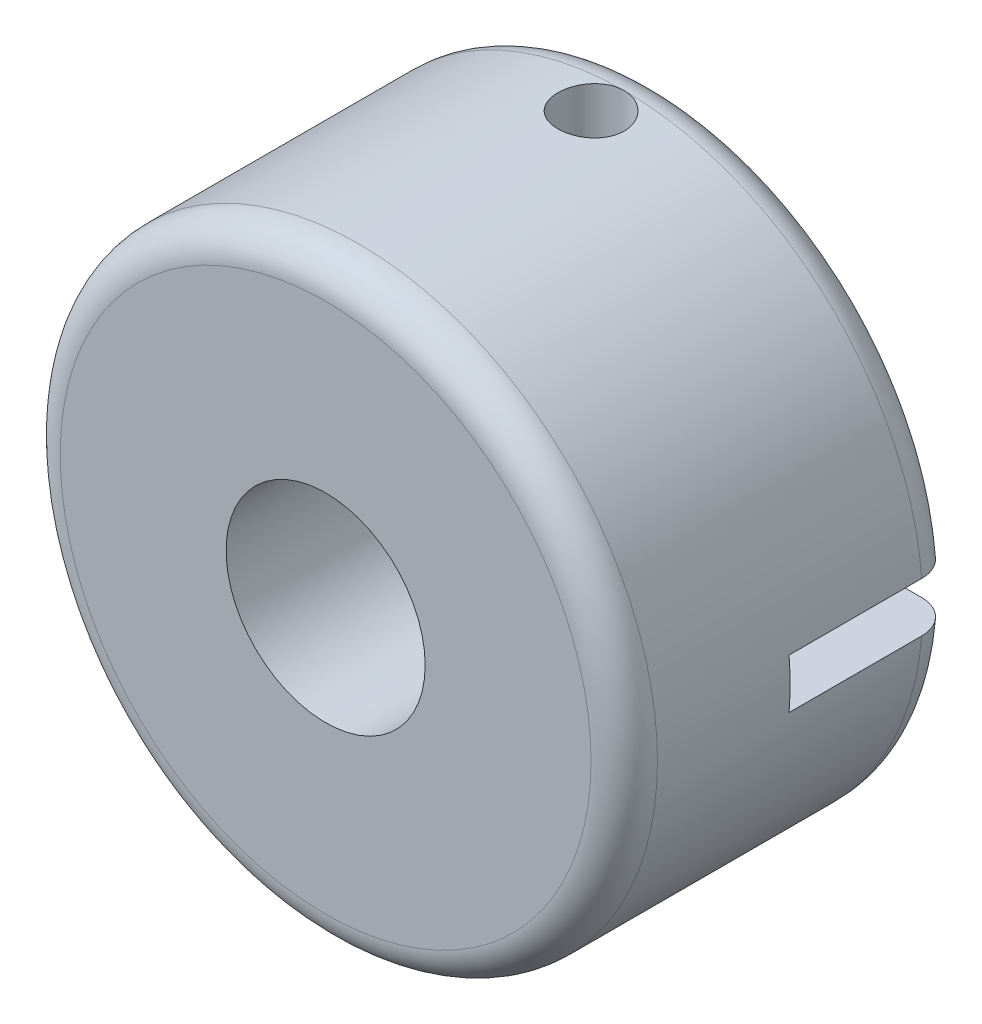
ISO-10303-21;
HEADER;
FILE_DESCRIPTION(('STEP AP214'),'2;1');
FILE_NAME('part.step','',(''),(''),'','','');
FILE_SCHEMA(('AUTOMOTIVE_DESIGN { 1 0 10303 214 1 1 1 1 }'));
ENDSEC;
DATA;
#1=APPLICATION_CONTEXT('core data for automotive mechanical design processes');
#2=APPLICATION_PROTOCOL_DEFINITION('international standard','automotive_design',2000,#1);
#3=PRODUCT_CONTEXT('',#1,'mechanical');
#4=PRODUCT('Part','Part','',(#3));
#5=PRODUCT_RELATED_PRODUCT_CATEGORY('part','',(#4));
#6=PRODUCT_DEFINITION_FORMATION('','',#4);
#7=PRODUCT_DEFINITION_CONTEXT('part definition',#1,'design');
#8=PRODUCT_DEFINITION('design','',#6,#7);
#9=PRODUCT_DEFINITION_SHAPE('','',#8);
#10=(LENGTH_UNIT() NAMED_UNIT(*) SI_UNIT(.MILLI.,.METRE.));
#11=(NAMED_UNIT(*) PLANE_ANGLE_UNIT() SI_UNIT($,.RADIAN.));
#12=(NAMED_UNIT(*) SI_UNIT($,.STERADIAN.) SOLID_ANGLE_UNIT());
#13=UNCERTAINTY_MEASURE_WITH_UNIT(LENGTH_MEASURE(1.E-05),#10,'distance_accuracy_value','');
#14=(GEOMETRIC_REPRESENTATION_CONTEXT(3) GLOBAL_UNCERTAINTY_ASSIGNED_CONTEXT((#13)) GLOBAL_UNIT_ASSIGNED_CONTEXT((#10,
#11,#12)) REPRESENTATION_CONTEXT('',''));
#15=CARTESIAN_POINT('',(0.,0.,0.));
#16=DIRECTION('',(0.,0.,1.));
#17=DIRECTION('',(1.,0.,0.));
#18=AXIS2_PLACEMENT_3D('',#15,#16,#17);
#19=CARTESIAN_POINT('',(-8.99999999999999,0.75,5.));
#20=DIRECTION('',(0.,0.,1.));
#21=DIRECTION('',(1.,0.,0.));
#22=AXIS2_PLACEMENT_3D('',#19,#20,#21);
#23=PLANE('',#22);
#24=DIRECTION('',(1.,0.,0.));
#25=VECTOR('',#24,1.);
#26=CARTESIAN_POINT('',(-8.99999999999999,0.75,5.));
#27=LINE('',#26,#25);
#28=CARTESIAN_POINT('',(-8.96869555732604,0.75,5.));
#29=VERTEX_POINT('',#28);
#30=CARTESIAN_POINT('',(-2.90473750965556,0.75,5.));
#31=VERTEX_POINT('',#30);
#32=EDGE_CURVE('E248',#29,#31,#27,.T.);
#33=ORIENTED_EDGE('',*,*,#32,.T.);
#34=CARTESIAN_POINT('',(0.,0.,5.));
#35=DIRECTION('',(0.,0.,1.));
#36=DIRECTION('',(1.,0.,0.));
#37=AXIS2_PLACEMENT_3D('',#34,#35,#36);
#38=CIRCLE('',#37,3.);
#39=CARTESIAN_POINT('',(-2.90473750965556,-0.75,5.));
#40=VERTEX_POINT('',#39);
#41=EDGE_CURVE('E132',#31,#40,#38,.T.);
#42=ORIENTED_EDGE('',*,*,#41,.T.);
#43=DIRECTION('',(1.,0.,0.));
#44=VECTOR('',#43,1.);
#45=CARTESIAN_POINT('',(-8.99999999999999,-0.75,5.));
#46=LINE('',#45,#44);
#47=CARTESIAN_POINT('',(-8.96869555732604,-0.75,5.));
#48=VERTEX_POINT('',#47);
#49=EDGE_CURVE('E243',#48,#40,#46,.T.);
#50=ORIENTED_EDGE('',*,*,#49,.F.);
#51=CARTESIAN_POINT('',(0.,0.,5.));
#52=DIRECTION('',(0.,0.,1.));
#53=DIRECTION('',(1.,0.,0.));
#54=AXIS2_PLACEMENT_3D('',#51,#52,#53);
#55=CIRCLE('',#54,9.);
#56=EDGE_CURVE('E264',#29,#48,#55,.T.);
#57=ORIENTED_EDGE('',*,*,#56,.F.);
#58=EDGE_LOOP('',(#33,#42,#50,#57));
#59=FACE_BOUND('',#58,.T.);
#60=ADVANCED_FACE('F39',(#59),#23,.F.);
#61=CARTESIAN_POINT('',(0.,0.,0.));
#62=DIRECTION('',(0.,0.,1.));
#63=DIRECTION('',(1.,0.,0.));
#64=AXIS2_PLACEMENT_3D('',#61,#62,#63);
#65=PLANE('',#64);
#66=DIRECTION('',(-1.,0.,0.));
#67=VECTOR('',#66,1.);
#68=CARTESIAN_POINT('',(0.,0.75,0.));
#69=LINE('',#68,#67);
#70=CARTESIAN_POINT('',(7.964766161037,0.75,0.));
#71=VERTEX_POINT('',#70);
#72=CARTESIAN_POINT('',(-7.96476616103699,0.75,0.));
#73=VERTEX_POINT('',#72);
#74=EDGE_CURVE('E261',#71,#73,#69,.T.);
#75=ORIENTED_EDGE('',*,*,#74,.T.);
#76=CARTESIAN_POINT('',(0.,0.,0.));
#77=DIRECTION('',(0.,0.,1.));
#78=DIRECTION('',(1.,0.,0.));
#79=AXIS2_PLACEMENT_3D('',#76,#77,#78);
#80=CIRCLE('',#79,8.);
#81=EDGE_CURVE('E204',#73,#71,#80,.F.);
#82=ORIENTED_EDGE('',*,*,#81,.T.);
#83=EDGE_LOOP('',(#75,#82));
#84=FACE_BOUND('',#83,.T.);
#85=ADVANCED_FACE('F221',(#84),#65,.F.);
#86=CARTESIAN_POINT('',(0.,0.,10.));
#87=DIRECTION('',(0.,0.,-1.));
#88=DIRECTION('',(-1.,0.,0.));
#89=AXIS2_PLACEMENT_3D('',#86,#87,#88);
#90=CYLINDRICAL_SURFACE('',#89,9.);
#91=CARTESIAN_POINT('',(0.,0.,9.));
#92=DIRECTION('',(0.,0.,1.));
#93=DIRECTION('',(1.,0.,0.));
#94=AXIS2_PLACEMENT_3D('',#91,#92,#93);
#95=CIRCLE('',#94,9.);
#96=CARTESIAN_POINT('',(9.00000000000001,0.,9.));
#97=VERTEX_POINT('',#96);
#98=EDGE_CURVE('E278',#97,#97,#95,.F.);
#99=ORIENTED_EDGE('',*,*,#98,.T.);
#100=EDGE_LOOP('',(#99));
#101=FACE_BOUND('',#100,.T.);
#102=DIRECTION('',(0.,0.,-1.));
#103=VECTOR('',#102,1.);
#104=CARTESIAN_POINT('',(8.96869555732606,0.75,10.));
#105=LINE('',#104,#103);
#106=CARTESIAN_POINT('',(8.96869555732605,0.75,5.));
#107=VERTEX_POINT('',#106);
#108=CARTESIAN_POINT('',(8.96869555732606,0.75,0.999999999999999));
#109=VERTEX_POINT('',#108);
#110=EDGE_CURVE('E256',#107,#109,#105,.T.);
#111=ORIENTED_EDGE('',*,*,#110,.T.);
#112=CARTESIAN_POINT('',(0.,0.,0.999999999999999));
#113=DIRECTION('',(0.,0.,1.));
#114=DIRECTION('',(1.,0.,0.));
#115=AXIS2_PLACEMENT_3D('',#112,#113,#114);
#116=CIRCLE('',#115,9.);
#117=CARTESIAN_POINT('',(-1.05251559554383E-12,9.00000000000103,0.999999999990753));
#118=VERTEX_POINT('',#117);
#119=EDGE_CURVE('E276',#109,#118,#116,.T.);
#120=ORIENTED_EDGE('',*,*,#119,.T.);
#121=CARTESIAN_POINT('',(0.,9.,3.));
#122=CARTESIAN_POINT('',(-0.0559853161747524,8.99999929277178,2.99999759358637));
#123=CARTESIAN_POINT('',(-0.112006801484748,8.9994720705524,2.99528262744756));
#124=CARTESIAN_POINT('',(-0.222494236923344,8.99741957978097,2.97654623578791));
#125=CARTESIAN_POINT('',(-0.276958444558886,8.99589323563574,2.96251478047458));
#126=CARTESIAN_POINT('',(-0.382715539535139,8.99201465369615,2.92556102240892));
#127=CARTESIAN_POINT('',(-0.434010410368808,8.9896629387358,2.90264434707015));
#128=CARTESIAN_POINT('',(-0.532015265049922,8.98439599054346,2.84858219290073));
#129=CARTESIAN_POINT('',(-0.578726105867442,8.98148086294344,2.81743825616542));
#130=CARTESIAN_POINT('',(-0.666452878735125,8.97539885909278,2.74765897493592));
#131=CARTESIAN_POINT('',(-0.707445789771045,8.97223104156821,2.70899476757161));
#132=CARTESIAN_POINT('',(-0.782375018550248,8.96600839162683,2.62533426198176));
#133=CARTESIAN_POINT('',(-0.816310996496124,8.96295356465643,2.58033765902074));
#134=CARTESIAN_POINT('',(-0.876246509081148,8.95729333974682,2.48514303588489));
#135=CARTESIAN_POINT('',(-0.902224877711691,8.95468914828773,2.43493161147508));
#136=CARTESIAN_POINT('',(-0.945372589003976,8.95023709017656,2.33082526965647));
#137=CARTESIAN_POINT('',(-0.962542197509879,8.94838920069999,2.27693046346601));
#138=CARTESIAN_POINT('',(-0.98751597246322,8.94566772115762,2.16722400106786));
#139=CARTESIAN_POINT('',(-0.995358649211085,8.94479012587347,2.11142121246454));
#140=CARTESIAN_POINT('',(-1.00157503001753,8.94409625330616,1.99928506908497));
#141=CARTESIAN_POINT('',(-0.999949037822415,8.94427994197797,1.94295173138612));
#142=CARTESIAN_POINT('',(-0.987305922139505,8.945684220507,1.83162026251421));
#143=CARTESIAN_POINT('',(-0.976331000864865,8.94690015061546,1.77661727166271));
#144=CARTESIAN_POINT('',(-0.945367305788448,8.95022463586703,1.66923868730563));
#145=CARTESIAN_POINT('',(-0.925378384650762,8.95233320560049,1.61686313676172));
#146=CARTESIAN_POINT('',(-0.876908030397261,8.95721072125194,1.51609378841845));
#147=CARTESIAN_POINT('',(-0.848408034407405,8.95998110794006,1.4677089919921));
#148=CARTESIAN_POINT('',(-0.783737853318381,8.96586893615957,1.37639317463457));
#149=CARTESIAN_POINT('',(-0.747567390883975,8.96898639023766,1.33346235098833));
#150=CARTESIAN_POINT('',(-0.668348074469788,8.97523784489643,1.2540280078457));
#151=CARTESIAN_POINT('',(-0.625262802834139,8.97837184304653,1.21756079738763));
#152=CARTESIAN_POINT('',(-0.533562909980494,8.9842872855091,1.15237080916384));
#153=CARTESIAN_POINT('',(-0.484948280138524,8.98706872927168,1.12364804347712));
#154=CARTESIAN_POINT('',(-0.383543317767759,8.9919669051296,1.07476311761762));
#155=CARTESIAN_POINT('',(-0.330752002400859,8.99408348018524,1.05460297951247));
#156=CARTESIAN_POINT('',(-0.222504877819688,8.99741192250643,1.02344311247917));
#157=CARTESIAN_POINT('',(-0.167049167128961,8.9986238231975,1.01244304510684));
#158=CARTESIAN_POINT('',(-0.0553616659471419,9.00000205532781,0.999962049141235));
#159=CARTESIAN_POINT('',(0.00086446444543915,9.00017388600447,0.998431053101896));
#160=CARTESIAN_POINT('',(0.112772494343573,8.99946740602149,1.00479989625653));
#161=CARTESIAN_POINT('',(0.168454402945653,8.99858911294477,1.01269957754646));
#162=CARTESIAN_POINT('',(0.277547529711659,8.99588454665255,1.03766397022792));
#163=CARTESIAN_POINT('',(0.330964219280911,8.99406071722912,1.05470505905874));
#164=CARTESIAN_POINT('',(0.434181135063442,8.98966950170817,1.09744413886405));
#165=CARTESIAN_POINT('',(0.48398126239614,8.98710209529006,1.12314236642551));
#166=CARTESIAN_POINT('',(0.578776632558722,8.98149678501137,1.18258914553548));
#167=CARTESIAN_POINT('',(0.623751265695505,8.97845698901806,1.2163703804699));
#168=CARTESIAN_POINT('',(0.707409917401092,8.97225357927183,1.29097764916718));
#169=CARTESIAN_POINT('',(0.746093740077782,8.969089961667,1.33180390222617));
#170=CARTESIAN_POINT('',(0.816248112164076,8.96297874201801,1.41956164453302));
#171=CARTESIAN_POINT('',(0.847685662689599,8.96003216821349,1.46651959523914));
#172=CARTESIAN_POINT('',(0.902227780025036,8.95470486436557,1.56507814174621));
#173=CARTESIAN_POINT('',(0.92533248350037,8.95232412504224,1.61667866138795));
#174=CARTESIAN_POINT('',(0.962498560505715,8.94840474113323,1.7229472293583));
#175=CARTESIAN_POINT('',(0.976579137405639,8.94686430941776,1.77760849287378));
#176=CARTESIAN_POINT('',(0.995359388833985,8.94479459787279,1.88853757387081));
#177=CARTESIAN_POINT('',(1.00005940160327,8.94426528158489,1.94480533335172));
#178=CARTESIAN_POINT('',(0.999939786708394,8.94427862923327,2.05702207753252));
#179=CARTESIAN_POINT('',(0.99517199521529,8.94481545604435,2.11297112534047));
#180=CARTESIAN_POINT('',(0.976361250402402,8.94688811478535,2.2232678691628));
#181=CARTESIAN_POINT('',(0.96231829018357,8.94842394745834,2.27761556398602));
#182=CARTESIAN_POINT('',(0.925370956312822,8.95231987255557,2.3831637552546));
#183=CARTESIAN_POINT('',(0.902468519690976,8.95467978479262,2.4343649368177));
#184=CARTESIAN_POINT('',(0.848457543936266,8.95995830601031,2.53220524672404));
#185=CARTESIAN_POINT('',(0.817348988118801,8.96287691612688,2.57884436579147));
#186=CARTESIAN_POINT('',(0.747614976268542,8.9689631397011,2.66650212306321));
#187=CARTESIAN_POINT('',(0.708950854501596,8.97213198178701,2.70748991773796));
#188=CARTESIAN_POINT('',(0.62528209624207,8.97835053070866,2.78241693610539));
#189=CARTESIAN_POINT('',(0.580275953803261,8.98140020902801,2.81635448092958));
#190=CARTESIAN_POINT('',(0.485047243387441,8.98704676048345,2.87630216517506));
#191=CARTESIAN_POINT('',(0.434809223208053,8.98964222793541,2.90228787486547));
#192=CARTESIAN_POINT('',(0.330684247580622,8.99407317716782,2.94541874622241));
#193=CARTESIAN_POINT('',(0.276801419972227,8.99590950246778,2.96257372536709));
#194=CARTESIAN_POINT('',(0.185520119656306,8.99816162762953,2.98334958073288));
#195=CARTESIAN_POINT('',(0.148702067430689,8.99884774300184,2.98958477421961));
#196=CARTESIAN_POINT('',(0.074594694951361,8.9997671635948,2.997910774432));
#197=CARTESIAN_POINT('',(0.0373053772387606,9.00000047125599,3.00000160349489));
#198=CARTESIAN_POINT('',(0.,9.,3.));
#199=B_SPLINE_CURVE_WITH_KNOTS('',3,(#121,#122,#123,#124,#125,#126,#127,#128,#129,#130,#131,
#132,#133,#134,#135,#136,#137,#138,#139,#140,#141,#142,#143,#144,#145,#146,#147,#148,#149,#150,
#151,#152,#153,#154,#155,#156,#157,#158,#159,#160,#161,#162,#163,#164,#165,#166,#167,#168,#169,
#170,#171,#172,#173,#174,#175,#176,#177,#178,#179,#180,#181,#182,#183,#184,#185,#186,#187,#188,
#189,#190,#191,#192,#193,#194,#195,#196,#197,#198),.UNSPECIFIED.,.T.,.F.,(4,2,2,2,2,2,2,2,2,2,2,
2,2,2,2,2,2,2,2,2,2,2,2,2,2,2,2,2,2,2,2,2,2,2,2,2,2,2,4),(0.,0.167819707135403,
0.335820376419494,0.503714816600372,0.671577809408595,0.840098248921826,1.00862680096148,
1.17759979653114,1.34656769227669,1.51483548110123,1.68309787207756,1.85060470671567,
2.01811427939092,2.18599189666506,2.3538755847981,2.52267436266645,2.6914734038088,
2.86031228477304,3.02914492724053,3.19708410335203,3.3650204675866,3.53252493879703,
3.70003398803135,3.86823215443822,4.03643555743391,4.20539044278928,4.37434255702207,
4.54293393626068,4.71151923638471,4.87918407769931,5.04684904372636,5.21447737229629,
5.3821060416891,5.55061614733196,5.71916633422646,5.88822926143292,6.05710382643978,
6.16892977749224,6.28075512582538),.UNSPECIFIED.);
#200=EDGE_CURVE('E155',#118,#118,#199,.T.);
#201=ORIENTED_EDGE('',*,*,#200,.T.);
#202=CARTESIAN_POINT('',(0.,0.,0.999999999999999));
#203=DIRECTION('',(0.,0.,1.));
#204=DIRECTION('',(1.,0.,0.));
#205=AXIS2_PLACEMENT_3D('',#202,#203,#204);
#206=CIRCLE('',#205,9.);
#207=CARTESIAN_POINT('',(-8.96869555732604,0.75,0.999999999999999));
#208=VERTEX_POINT('',#207);
#209=EDGE_CURVE('E274',#118,#208,#206,.T.);
#210=ORIENTED_EDGE('',*,*,#209,.T.);
#211=DIRECTION('',(0.,0.,-1.));
#212=VECTOR('',#211,1.);
#213=CARTESIAN_POINT('',(-8.96869555732604,0.75,10.));
#214=LINE('',#213,#212);
#215=EDGE_CURVE('E254',#208,#29,#214,.F.);
#216=ORIENTED_EDGE('',*,*,#215,.T.);
#217=ORIENTED_EDGE('',*,*,#56,.T.);
#218=DIRECTION('',(0.,0.,-1.));
#219=VECTOR('',#218,1.);
#220=CARTESIAN_POINT('',(-8.96869555732604,-0.75,10.));
#221=LINE('',#220,#219);
#222=CARTESIAN_POINT('',(-8.96869555732604,-0.75,0.999999999999999));
#223=VERTEX_POINT('',#222);
#224=EDGE_CURVE('E251',#48,#223,#221,.T.);
#225=ORIENTED_EDGE('',*,*,#224,.T.);
#226=CARTESIAN_POINT('',(0.,0.,0.999999999999999));
#227=DIRECTION('',(0.,0.,1.));
#228=DIRECTION('',(1.,0.,0.));
#229=AXIS2_PLACEMENT_3D('',#226,#227,#228);
#230=CIRCLE('',#229,9.);
#231=CARTESIAN_POINT('',(1.05251559554383E-12,-9.00000000000103,0.999999999990753));
#232=VERTEX_POINT('',#231);
#233=EDGE_CURVE('E271',#223,#232,#230,.T.);
#234=ORIENTED_EDGE('',*,*,#233,.T.);
#235=CARTESIAN_POINT('',(0.,-9.,3.));
#236=CARTESIAN_POINT('',(0.0559853161747594,-8.99999929277178,2.99999759358637));
#237=CARTESIAN_POINT('',(0.112006801484755,-8.9994720705524,2.99528262744756));
#238=CARTESIAN_POINT('',(0.222494236923351,-8.99741957978097,2.97654623578791));
#239=CARTESIAN_POINT('',(0.276958444558893,-8.99589323563575,2.96251478047458));
#240=CARTESIAN_POINT('',(0.382715539535145,-8.99201465369615,2.92556102240892));
#241=CARTESIAN_POINT('',(0.434010410368814,-8.9896629387358,2.90264434707015));
#242=CARTESIAN_POINT('',(0.532015265049928,-8.98439599054346,2.84858219290073));
#243=CARTESIAN_POINT('',(0.578726105867448,-8.98148086294344,2.81743825616542));
#244=CARTESIAN_POINT('',(0.66645287873513,-8.97539885909278,2.74765897493592));
#245=CARTESIAN_POINT('',(0.70744578977105,-8.97223104156821,2.70899476757161));
#246=CARTESIAN_POINT('',(0.782375018550253,-8.96600839162683,2.62533426198175));
#247=CARTESIAN_POINT('',(0.816310996496128,-8.96295356465643,2.58033765902073));
#248=CARTESIAN_POINT('',(0.876246509081151,-8.95729333974683,2.48514303588489));
#249=CARTESIAN_POINT('',(0.902224877711694,-8.95468914828773,2.43493161147507));
#250=CARTESIAN_POINT('',(0.945372589003978,-8.95023709017656,2.33082526965646));
#251=CARTESIAN_POINT('',(0.962542197509881,-8.94838920069999,2.276930463466));
#252=CARTESIAN_POINT('',(0.987515972463221,-8.94566772115763,2.16722400106785));
#253=CARTESIAN_POINT('',(0.995358649211086,-8.94479012587347,2.11142121246453));
#254=CARTESIAN_POINT('',(1.00157503001753,-8.94409625330616,1.99928506908496));
#255=CARTESIAN_POINT('',(0.999949037822415,-8.94427994197797,1.94295173138611));
#256=CARTESIAN_POINT('',(0.987305922139504,-8.945684220507,1.83162026251421));
#257=CARTESIAN_POINT('',(0.976331000864863,-8.94690015061547,1.7766172716627));
#258=CARTESIAN_POINT('',(0.945367305788446,-8.95022463586703,1.66923868730562));
#259=CARTESIAN_POINT('',(0.925378384650759,-8.95233320560049,1.61686313676172));
#260=CARTESIAN_POINT('',(0.876908030397257,-8.95721072125194,1.51609378841845));
#261=CARTESIAN_POINT('',(0.848408034407401,-8.95998110794007,1.46770899199209));
#262=CARTESIAN_POINT('',(0.783737853318376,-8.96586893615957,1.37639317463457));
#263=CARTESIAN_POINT('',(0.74756739088397,-8.96898639023766,1.33346235098832));
#264=CARTESIAN_POINT('',(0.668348074469782,-8.97523784489643,1.2540280078457));
#265=CARTESIAN_POINT('',(0.625262802834133,-8.97837184304653,1.21756079738763));
#266=CARTESIAN_POINT('',(0.533562909980488,-8.9842872855091,1.15237080916383));
#267=CARTESIAN_POINT('',(0.484948280138517,-8.98706872927169,1.12364804347712));
#268=CARTESIAN_POINT('',(0.383543317767752,-8.9919669051296,1.07476311761762));
#269=CARTESIAN_POINT('',(0.330752002400852,-8.99408348018524,1.05460297951247));
#270=CARTESIAN_POINT('',(0.22250487781968,-8.99741192250643,1.02344311247917));
#271=CARTESIAN_POINT('',(0.167049167128954,-8.9986238231975,1.01244304510684));
#272=CARTESIAN_POINT('',(0.0553616659471345,-9.0000020553278,0.999962049141235));
#273=CARTESIAN_POINT('',(-0.000864464445446617,-9.00017388600447,0.998431053101896));
#274=CARTESIAN_POINT('',(-0.112772494343581,-8.99946740602149,1.00479989625653));
#275=CARTESIAN_POINT('',(-0.16845440294566,-8.99858911294476,1.01269957754646));
#276=CARTESIAN_POINT('',(-0.277547529711666,-8.99588454665255,1.03766397022792));
#277=CARTESIAN_POINT('',(-0.330964219280918,-8.99406071722912,1.05470505905874));
#278=CARTESIAN_POINT('',(-0.434181135063448,-8.98966950170817,1.09744413886406));
#279=CARTESIAN_POINT('',(-0.483981262396147,-8.98710209529006,1.12314236642552));
#280=CARTESIAN_POINT('',(-0.578776632558728,-8.98149678501137,1.18258914553549));
#281=CARTESIAN_POINT('',(-0.623751265695511,-8.97845698901806,1.21637038046991));
#282=CARTESIAN_POINT('',(-0.707409917401097,-8.97225357927183,1.29097764916718));
#283=CARTESIAN_POINT('',(-0.746093740077788,-8.96908996166699,1.33180390222617));
#284=CARTESIAN_POINT('',(-0.816248112164081,-8.96297874201801,1.41956164453303));
#285=CARTESIAN_POINT('',(-0.847685662689604,-8.96003216821349,1.46651959523914));
#286=CARTESIAN_POINT('',(-0.902227780025039,-8.95470486436557,1.56507814174622));
#287=CARTESIAN_POINT('',(-0.925332483500373,-8.95232412504224,1.61667866138796));
#288=CARTESIAN_POINT('',(-0.962498560505717,-8.94840474113323,1.72294722935831));
#289=CARTESIAN_POINT('',(-0.97657913740564,-8.94686430941776,1.77760849287379));
#290=CARTESIAN_POINT('',(-0.995359388833986,-8.94479459787279,1.88853757387082));
#291=CARTESIAN_POINT('',(-1.00005940160327,-8.94426528158489,1.94480533335173));
#292=CARTESIAN_POINT('',(-0.999939786708393,-8.94427862923327,2.05702207753253));
#293=CARTESIAN_POINT('',(-0.995171995215289,-8.94481545604435,2.11297112534048));
#294=CARTESIAN_POINT('',(-0.9763612504024,-8.94688811478535,2.2232678691628));
#295=CARTESIAN_POINT('',(-0.962318290183568,-8.94842394745834,2.27761556398603));
#296=CARTESIAN_POINT('',(-0.92537095631282,-8.95231987255557,2.38316375525461));
#297=CARTESIAN_POINT('',(-0.902468519690973,-8.95467978479262,2.43436493681771));
#298=CARTESIAN_POINT('',(-0.848457543936262,-8.95995830601031,2.53220524672405));
#299=CARTESIAN_POINT('',(-0.817348988118797,-8.96287691612688,2.57884436579148));
#300=CARTESIAN_POINT('',(-0.747614976268537,-8.9689631397011,2.66650212306321));
#301=CARTESIAN_POINT('',(-0.70895085450159,-8.97213198178701,2.70748991773796));
#302=CARTESIAN_POINT('',(-0.625282096242063,-8.97835053070866,2.7824169361054));
#303=CARTESIAN_POINT('',(-0.580275953803255,-8.981400209028,2.81635448092958));
#304=CARTESIAN_POINT('',(-0.485047243387434,-8.98704676048345,2.87630216517507));
#305=CARTESIAN_POINT('',(-0.434809223208046,-8.98964222793541,2.90228787486547));
#306=CARTESIAN_POINT('',(-0.330684247580615,-8.99407317716782,2.94541874622241));
#307=CARTESIAN_POINT('',(-0.27680141997222,-8.99590950246778,2.96257372536709));
#308=CARTESIAN_POINT('',(-0.185520119656299,-8.99816162762953,2.98334958073288));
#309=CARTESIAN_POINT('',(-0.148702067430681,-8.99884774300184,2.98958477421961));
#310=CARTESIAN_POINT('',(-0.0745946949513537,-8.9997671635948,2.997910774432));
#311=CARTESIAN_POINT('',(-0.0373053772387534,-9.00000047125599,3.00000160349489));
#312=CARTESIAN_POINT('',(0.,-9.,3.));
#313=B_SPLINE_CURVE_WITH_KNOTS('',3,(#235,#236,#237,#238,#239,#240,#241,#242,#243,#244,#245,
#246,#247,#248,#249,#250,#251,#252,#253,#254,#255,#256,#257,#258,#259,#260,#261,#262,#263,#264,
#265,#266,#267,#268,#269,#270,#271,#272,#273,#274,#275,#276,#277,#278,#279,#280,#281,#282,#283,
#284,#285,#286,#287,#288,#289,#290,#291,#292,#293,#294,#295,#296,#297,#298,#299,#300,#301,#302,
#303,#304,#305,#306,#307,#308,#309,#310,#311,#312),.UNSPECIFIED.,.T.,.F.,(4,2,2,2,2,2,2,2,2,2,2,
2,2,2,2,2,2,2,2,2,2,2,2,2,2,2,2,2,2,2,2,2,2,2,2,2,2,2,4),(0.,0.167819707135403,
0.335820376419494,0.503714816600372,0.671577809408595,0.840098248921826,1.00862680096148,
1.17759979653114,1.34656769227669,1.51483548110123,1.68309787207756,1.85060470671567,
2.01811427939092,2.18599189666506,2.3538755847981,2.52267436266645,2.6914734038088,
2.86031228477304,3.02914492724053,3.19708410335203,3.3650204675866,3.53252493879703,
3.70003398803135,3.86823215443822,4.03643555743391,4.20539044278928,4.37434255702207,
4.54293393626068,4.71151923638471,4.87918407769931,5.04684904372636,5.21447737229629,
5.3821060416891,5.55061614733196,5.71916633422647,5.88822926143292,6.05710382643978,
6.16892977749224,6.28075512582538),.UNSPECIFIED.);
#314=EDGE_CURVE('E163',#232,#232,#313,.T.);
#315=ORIENTED_EDGE('',*,*,#314,.T.);
#316=CARTESIAN_POINT('',(0.,0.,0.999999999999999));
#317=DIRECTION('',(0.,0.,1.));
#318=DIRECTION('',(1.,0.,0.));
#319=AXIS2_PLACEMENT_3D('',#316,#317,#318);
#320=CIRCLE('',#319,9.);
#321=CARTESIAN_POINT('',(8.96869555732606,-0.75,0.999999999999999));
#322=VERTEX_POINT('',#321);
#323=EDGE_CURVE('E269',#232,#322,#320,.T.);
#324=ORIENTED_EDGE('',*,*,#323,.T.);
#325=DIRECTION('',(0.,0.,-1.));
#326=VECTOR('',#325,1.);
#327=CARTESIAN_POINT('',(8.96869555732606,-0.75,10.));
#328=LINE('',#327,#326);
#329=CARTESIAN_POINT('',(8.96869555732605,-0.75,5.));
#330=VERTEX_POINT('',#329);
#331=EDGE_CURVE('E249',#322,#330,#328,.F.);
#332=ORIENTED_EDGE('',*,*,#331,.T.);
#333=EDGE_CURVE('E241',#330,#107,#55,.T.);
#334=ORIENTED_EDGE('',*,*,#333,.T.);
#335=EDGE_LOOP('',(#111,#120,#201,#210,#216,#217,#225,#234,#315,#324,#332,#334));
#336=FACE_BOUND('',#335,.T.);
#337=ADVANCED_FACE('F168',(#101,#336),#90,.T.);
#338=CARTESIAN_POINT('',(0.,0.,10.));
#339=DIRECTION('',(0.,0.,1.));
#340=DIRECTION('',(1.,0.,0.));
#341=AXIS2_PLACEMENT_3D('',#338,#339,#340);
#342=PLANE('',#341);
#343=CARTESIAN_POINT('',(0.,0.,10.));
#344=DIRECTION('',(0.,0.,1.));
#345=DIRECTION('',(1.,0.,0.));
#346=AXIS2_PLACEMENT_3D('',#343,#344,#345);
#347=CIRCLE('',#346,3.);
#348=CARTESIAN_POINT('',(3.,0.,10.));
#349=VERTEX_POINT('',#348);
#350=EDGE_CURVE('E413',#349,#349,#347,.T.);
#351=ORIENTED_EDGE('',*,*,#350,.F.);
#352=EDGE_LOOP('',(#351));
#353=FACE_BOUND('',#352,.T.);
#354=CARTESIAN_POINT('',(0.,0.,10.));
#355=DIRECTION('',(0.,0.,1.));
#356=DIRECTION('',(1.,0.,0.));
#357=AXIS2_PLACEMENT_3D('',#354,#355,#356);
#358=CIRCLE('',#357,8.);
#359=CARTESIAN_POINT('',(8.00000000000001,0.,10.));
#360=VERTEX_POINT('',#359);
#361=EDGE_CURVE('E266',#360,#360,#358,.T.);
#362=ORIENTED_EDGE('',*,*,#361,.T.);
#363=EDGE_LOOP('',(#362));
#364=FACE_BOUND('',#363,.T.);
#365=ADVANCED_FACE('F235',(#353,#364),#342,.T.);
#366=DIRECTION('',(1.,0.,0.));
#367=VECTOR('',#366,1.);
#368=CARTESIAN_POINT('',(0.,-0.75,0.));
#369=LINE('',#368,#367);
#370=CARTESIAN_POINT('',(-7.96476616103699,-0.75,0.));
#371=VERTEX_POINT('',#370);
#372=CARTESIAN_POINT('',(7.964766161037,-0.75,0.));
#373=VERTEX_POINT('',#372);
#374=EDGE_CURVE('E259',#371,#373,#369,.T.);
#375=ORIENTED_EDGE('',*,*,#374,.T.);
#376=CARTESIAN_POINT('',(0.,0.,0.));
#377=DIRECTION('',(0.,0.,1.));
#378=DIRECTION('',(1.,0.,0.));
#379=AXIS2_PLACEMENT_3D('',#376,#377,#378);
#380=CIRCLE('',#379,8.);
#381=EDGE_CURVE('E425',#373,#371,#380,.F.);
#382=ORIENTED_EDGE('',*,*,#381,.T.);
#383=EDGE_LOOP('',(#375,#382));
#384=FACE_BOUND('',#383,.T.);
#385=ADVANCED_FACE('F227',(#384),#65,.F.);
#386=CARTESIAN_POINT('',(2.90473750965556,-0.75,5.));
#387=VERTEX_POINT('',#386);
#388=EDGE_CURVE('E239',#387,#330,#46,.T.);
#389=ORIENTED_EDGE('',*,*,#388,.F.);
#390=CARTESIAN_POINT('',(2.90473750965556,0.75,5.));
#391=VERTEX_POINT('',#390);
#392=EDGE_CURVE('E145',#387,#391,#38,.T.);
#393=ORIENTED_EDGE('',*,*,#392,.T.);
#394=EDGE_CURVE('E143',#391,#107,#27,.T.);
#395=ORIENTED_EDGE('',*,*,#394,.T.);
#396=ORIENTED_EDGE('',*,*,#333,.F.);
#397=EDGE_LOOP('',(#389,#393,#395,#396));
#398=FACE_BOUND('',#397,.T.);
#399=ADVANCED_FACE('F185',(#398),#23,.F.);
#400=CARTESIAN_POINT('',(-8.99999999999999,0.75,-5.));
#401=DIRECTION('',(0.,1.,0.));
#402=DIRECTION('',(0.,0.,1.));
#403=AXIS2_PLACEMENT_3D('',#400,#401,#402);
#404=PLANE('',#403);
#405=CARTESIAN_POINT('',(0.,0.750000000000001,2.));
#406=DIRECTION('',(0.,1.,0.));
#407=DIRECTION('',(0.,0.,1.));
#408=AXIS2_PLACEMENT_3D('',#405,#406,#407);
#409=CIRCLE('',#408,1.);
#410=CARTESIAN_POINT('',(0.,0.750000000000001,3.));
#411=VERTEX_POINT('',#410);
#412=EDGE_CURVE('E148',#411,#411,#409,.T.);
#413=ORIENTED_EDGE('',*,*,#412,.T.);
#414=EDGE_LOOP('',(#413));
#415=FACE_BOUND('',#414,.T.);
#416=DIRECTION('',(1.,0.,0.));
#417=VECTOR('',#416,1.);
#418=CARTESIAN_POINT('',(-8.99999999999999,0.75,4.));
#419=LINE('',#418,#417);
#420=CARTESIAN_POINT('',(-2.90473750965556,0.75,4.));
#421=VERTEX_POINT('',#420);
#422=CARTESIAN_POINT('',(2.90473750965556,0.75,4.));
#423=VERTEX_POINT('',#422);
#424=EDGE_CURVE('E125',#421,#423,#419,.T.);
#425=ORIENTED_EDGE('',*,*,#424,.F.);
#426=DIRECTION('',(0.,0.,1.));
#427=VECTOR('',#426,1.);
#428=CARTESIAN_POINT('',(-2.90473750965556,0.75,4.));
#429=LINE('',#428,#427);
#430=EDGE_CURVE('E138',#421,#31,#429,.T.);
#431=ORIENTED_EDGE('',*,*,#430,.T.);
#432=ORIENTED_EDGE('',*,*,#32,.F.);
#433=ORIENTED_EDGE('',*,*,#215,.F.);
#434=CARTESIAN_POINT('',(-8.96869555732604,0.75,0.999999999999999));
#435=CARTESIAN_POINT('',(-8.96869541644726,0.75,0.971938771164157));
#436=CARTESIAN_POINT('',(-8.96750953804669,0.75,0.94389100795869));
#437=CARTESIAN_POINT('',(-8.96277890032148,0.75,0.887996683072249));
#438=CARTESIAN_POINT('',(-8.95923426887937,0.75,0.860150110566222));
#439=CARTESIAN_POINT('',(-8.94509736037255,0.75,0.777265252117966));
#440=CARTESIAN_POINT('',(-8.93100196721814,0.75,0.722782963978199));
#441=CARTESIAN_POINT('',(-8.89386762763864,0.75,0.616960938259765));
#442=CARTESIAN_POINT('',(-8.87082466204994,0.75,0.565622624939151));
#443=CARTESIAN_POINT('',(-8.81646078193327,0.75,0.467536309858369));
#444=CARTESIAN_POINT('',(-8.78514111612242,0.75,0.420787617113832));
#445=CARTESIAN_POINT('',(-8.71507097664052,0.75,0.333131671809602));
#446=CARTESIAN_POINT('',(-8.67631001450132,0.75,0.29223280825648));
#447=CARTESIAN_POINT('',(-8.59248354845929,0.75,0.217488451727677));
#448=CARTESIAN_POINT('',(-8.54741679401137,0.75,0.183644361155426));
#449=CARTESIAN_POINT('',(-8.45210170887686,0.75,0.123853422982292));
#450=CARTESIAN_POINT('',(-8.40183568001631,0.75,0.097934822155866));
#451=CARTESIAN_POINT('',(-8.29768562806305,0.75,0.0548809484099991));
#452=CARTESIAN_POINT('',(-8.24380350799913,0.75,0.0377410958925673));
#453=CARTESIAN_POINT('',(-8.15213985833563,0.75,0.0168387392777092));
#454=CARTESIAN_POINT('',(-8.11491909957907,0.75,0.0105275842854203));
#455=CARTESIAN_POINT('',(-8.04005923951322,0.75,0.00210867882223861));
#456=CARTESIAN_POINT('',(-8.00242081313563,0.75,-5.07430948762938E-06));
#457=CARTESIAN_POINT('',(-7.96476616103699,0.75,0.));
#458=B_SPLINE_CURVE_WITH_KNOTS('',3,(#434,#435,#436,#437,#438,#439,#440,#441,#442,#443,#444,
#445,#446,#447,#448,#449,#450,#451,#452,#453,#454,#455,#456,#457),.UNSPECIFIED.,.F.,.F.,(4,2,2,
2,2,2,2,2,2,2,2,4),(0.,0.0841319019113087,0.168259242886338,0.336221121513868,0.504258534445792,
0.672270609802214,0.840521259421484,1.00880532340325,1.177682349992,1.34647118876652,
1.45950596160396,1.57237896783481),.UNSPECIFIED.);
#459=EDGE_CURVE('E198',#208,#73,#458,.T.);
#460=ORIENTED_EDGE('',*,*,#459,.T.);
#461=ORIENTED_EDGE('',*,*,#74,.F.);
#462=CARTESIAN_POINT('',(7.964766161037,0.75,0.));
#463=CARTESIAN_POINT('',(7.99309788212,0.75,2.50589722600283E-07));
#464=CARTESIAN_POINT('',(8.02141611139521,0.75,0.00119419430778384));
#465=CARTESIAN_POINT('',(8.0778509109206,0.75,0.00595842148229962));
#466=CARTESIAN_POINT('',(8.10596748820434,0.75,0.00952862164422522));
#467=CARTESIAN_POINT('',(8.18967117324831,0.75,0.0237727742776612));
#468=CARTESIAN_POINT('',(8.24469905998512,0.75,0.0379803571275533));
#469=CARTESIAN_POINT('',(8.35158889423852,0.75,0.075438459515364));
#470=CARTESIAN_POINT('',(8.4034491054448,0.75,0.0986938879225727));
#471=CARTESIAN_POINT('',(8.5025133225506,0.75,0.153597940217333));
#472=CARTESIAN_POINT('',(8.54971834915148,0.75,0.185244718568878));
#473=CARTESIAN_POINT('',(8.63801328230852,0.75,0.255961582064425));
#474=CARTESIAN_POINT('',(8.67911706169414,0.75,0.295014352048811));
#475=CARTESIAN_POINT('',(8.75416374986323,0.75,0.379499319958765));
#476=CARTESIAN_POINT('',(8.78810529319477,0.75,0.424932731583529));
#477=CARTESIAN_POINT('',(8.84772302571638,0.75,0.520701907899368));
#478=CARTESIAN_POINT('',(8.8734281736772,0.75,0.571019667677278));
#479=CARTESIAN_POINT('',(8.91598221157684,0.75,0.67525488532772));
#480=CARTESIAN_POINT('',(8.93283674503362,0.75,0.729170024579686));
#481=CARTESIAN_POINT('',(8.95289203512951,0.75,0.819529162481366));
#482=CARTESIAN_POINT('',(8.95881484912891,0.75,0.855392284546815));
#483=CARTESIAN_POINT('',(8.96671595485372,0.75,0.927498458195467));
#484=CARTESIAN_POINT('',(8.96869986964837,0.75,0.963740893816843));
#485=CARTESIAN_POINT('',(8.96869555732606,0.75,0.999999999999999));
#486=B_SPLINE_CURVE_WITH_KNOTS('',3,(#462,#463,#464,#465,#466,#467,#468,#469,#470,#471,#472,
#473,#474,#475,#476,#477,#478,#479,#480,#481,#482,#483,#484,#485),.UNSPECIFIED.,.F.,.F.,(4,2,2,
2,2,2,2,2,2,2,2,4),(0.,0.0849431653101042,0.16988335327811,0.339506558983962,0.50922192164468,
0.678899989186968,0.848186135125652,1.01750452569727,1.18622089673685,1.35482955620281,
1.46367565237029,1.57236625065615),.UNSPECIFIED.);
#487=EDGE_CURVE('E191',#71,#109,#486,.T.);
#488=ORIENTED_EDGE('',*,*,#487,.T.);
#489=ORIENTED_EDGE('',*,*,#110,.F.);
#490=ORIENTED_EDGE('',*,*,#394,.F.);
#491=DIRECTION('',(0.,0.,1.));
#492=VECTOR('',#491,1.);
#493=CARTESIAN_POINT('',(2.90473750965556,0.75,4.));
#494=LINE('',#493,#492);
#495=EDGE_CURVE('E136',#391,#423,#494,.F.);
#496=ORIENTED_EDGE('',*,*,#495,.T.);
#497=EDGE_LOOP('',(#425,#431,#432,#433,#460,#461,#488,#489,#490,#496));
#498=FACE_BOUND('',#497,.T.);
#499=ADVANCED_FACE('F141',(#415,#498),#404,.F.);
#500=CARTESIAN_POINT('',(-8.99999999999999,-0.75,-5.));
#501=DIRECTION('',(0.,-1.,0.));
#502=DIRECTION('',(0.,0.,-1.));
#503=AXIS2_PLACEMENT_3D('',#500,#501,#502);
#504=PLANE('',#503);
#505=CARTESIAN_POINT('',(0.,-0.750000000000001,2.));
#506=DIRECTION('',(0.,-1.,0.));
#507=DIRECTION('',(0.,0.,-1.));
#508=AXIS2_PLACEMENT_3D('',#505,#506,#507);
#509=CIRCLE('',#508,1.);
#510=CARTESIAN_POINT('',(0.,-0.750000000000001,1.));
#511=VERTEX_POINT('',#510);
#512=EDGE_CURVE('E144',#511,#511,#509,.T.);
#513=ORIENTED_EDGE('',*,*,#512,.T.);
#514=EDGE_LOOP('',(#513));
#515=FACE_BOUND('',#514,.T.);
#516=DIRECTION('',(-1.,0.,0.));
#517=VECTOR('',#516,1.);
#518=CARTESIAN_POINT('',(-8.99999999999999,-0.75,4.));
#519=LINE('',#518,#517);
#520=CARTESIAN_POINT('',(2.90473750965556,-0.75,4.));
#521=VERTEX_POINT('',#520);
#522=CARTESIAN_POINT('',(-2.90473750965556,-0.75,4.));
#523=VERTEX_POINT('',#522);
#524=EDGE_CURVE('E302',#521,#523,#519,.T.);
#525=ORIENTED_EDGE('',*,*,#524,.F.);
#526=DIRECTION('',(0.,0.,1.));
#527=VECTOR('',#526,1.);
#528=CARTESIAN_POINT('',(2.90473750965556,-0.75,4.));
#529=LINE('',#528,#527);
#530=EDGE_CURVE('E11',#521,#387,#529,.T.);
#531=ORIENTED_EDGE('',*,*,#530,.T.);
#532=ORIENTED_EDGE('',*,*,#388,.T.);
#533=ORIENTED_EDGE('',*,*,#331,.F.);
#534=CARTESIAN_POINT('',(8.96869555732606,-0.75,0.999999999999999));
#535=CARTESIAN_POINT('',(8.96869541644728,-0.75,0.971938771164157));
#536=CARTESIAN_POINT('',(8.9675095380467,-0.75,0.94389100795869));
#537=CARTESIAN_POINT('',(8.9627789003215,-0.75,0.887996683072249));
#538=CARTESIAN_POINT('',(8.95923426887938,-0.75,0.860150110566222));
#539=CARTESIAN_POINT('',(8.94509736037257,-0.75,0.777265252117966));
#540=CARTESIAN_POINT('',(8.93100196721815,-0.75,0.722782963978199));
#541=CARTESIAN_POINT('',(8.89386762763866,-0.75,0.616960938259765));
#542=CARTESIAN_POINT('',(8.87082466204995,-0.75,0.565622624939151));
#543=CARTESIAN_POINT('',(8.81646078193329,-0.75,0.467536309858369));
#544=CARTESIAN_POINT('',(8.78514111612244,-0.75,0.420787617113832));
#545=CARTESIAN_POINT('',(8.71507097664054,-0.75,0.333131671809602));
#546=CARTESIAN_POINT('',(8.67631001450134,-0.75,0.29223280825648));
#547=CARTESIAN_POINT('',(8.5924835484593,-0.75,0.217488451727677));
#548=CARTESIAN_POINT('',(8.54741679401138,-0.75,0.183644361155426));
#549=CARTESIAN_POINT('',(8.45210170887687,-0.75,0.123853422982292));
#550=CARTESIAN_POINT('',(8.40183568001632,-0.75,0.097934822155866));
#551=CARTESIAN_POINT('',(8.29768562806306,-0.75,0.0548809484099991));
#552=CARTESIAN_POINT('',(8.24380350799914,-0.75,0.0377410958925673));
#553=CARTESIAN_POINT('',(8.15213985833564,-0.75,0.0168387392777092));
#554=CARTESIAN_POINT('',(8.11491909957908,-0.75,0.0105275842854203));
#555=CARTESIAN_POINT('',(8.04005923951323,-0.75,0.00210867882223861));
#556=CARTESIAN_POINT('',(8.00242081313564,-0.75,-5.07430948762938E-06));
#557=CARTESIAN_POINT('',(7.964766161037,-0.75,0.));
#558=B_SPLINE_CURVE_WITH_KNOTS('',3,(#534,#535,#536,#537,#538,#539,#540,#541,#542,#543,#544,
#545,#546,#547,#548,#549,#550,#551,#552,#553,#554,#555,#556,#557),.UNSPECIFIED.,.F.,.F.,(4,2,2,
2,2,2,2,2,2,2,2,4),(0.,0.0841319019113087,0.168259242886338,0.336221121513868,0.504258534445792,
0.672270609802214,0.840521259421484,1.00880532340325,1.177682349992,1.34647118876652,
1.45950596160396,1.57237896783481),.UNSPECIFIED.);
#559=EDGE_CURVE('E62',#322,#373,#558,.T.);
#560=ORIENTED_EDGE('',*,*,#559,.T.);
#561=ORIENTED_EDGE('',*,*,#374,.F.);
#562=CARTESIAN_POINT('',(-7.96476616103699,-0.75,0.));
#563=CARTESIAN_POINT('',(-7.99309788211998,-0.75,2.50589722600283E-07));
#564=CARTESIAN_POINT('',(-8.0214161113952,-0.75,0.00119419430778384));
#565=CARTESIAN_POINT('',(-8.07785091092059,-0.75,0.00595842148229962));
#566=CARTESIAN_POINT('',(-8.10596748820432,-0.75,0.00952862164422522));
#567=CARTESIAN_POINT('',(-8.1896711732483,-0.75,0.0237727742776612));
#568=CARTESIAN_POINT('',(-8.2446990599851,-0.75,0.0379803571275533));
#569=CARTESIAN_POINT('',(-8.3515888942385,-0.75,0.075438459515364));
#570=CARTESIAN_POINT('',(-8.40344910544478,-0.75,0.0986938879225727));
#571=CARTESIAN_POINT('',(-8.50251332255059,-0.75,0.153597940217333));
#572=CARTESIAN_POINT('',(-8.54971834915147,-0.75,0.185244718568878));
#573=CARTESIAN_POINT('',(-8.63801328230851,-0.75,0.255961582064425));
#574=CARTESIAN_POINT('',(-8.67911706169413,-0.75,0.295014352048811));
#575=CARTESIAN_POINT('',(-8.75416374986322,-0.75,0.379499319958765));
#576=CARTESIAN_POINT('',(-8.78810529319476,-0.75,0.424932731583529));
#577=CARTESIAN_POINT('',(-8.84772302571636,-0.75,0.520701907899368));
#578=CARTESIAN_POINT('',(-8.87342817367719,-0.75,0.571019667677278));
#579=CARTESIAN_POINT('',(-8.91598221157683,-0.75,0.67525488532772));
#580=CARTESIAN_POINT('',(-8.93283674503361,-0.75,0.729170024579686));
#581=CARTESIAN_POINT('',(-8.95289203512949,-0.75,0.819529162481366));
#582=CARTESIAN_POINT('',(-8.95881484912889,-0.75,0.855392284546815));
#583=CARTESIAN_POINT('',(-8.9667159548537,-0.75,0.927498458195467));
#584=CARTESIAN_POINT('',(-8.96869986964835,-0.75,0.963740893816843));
#585=CARTESIAN_POINT('',(-8.96869555732604,-0.75,0.999999999999999));
#586=B_SPLINE_CURVE_WITH_KNOTS('',3,(#562,#563,#564,#565,#566,#567,#568,#569,#570,#571,#572,
#573,#574,#575,#576,#577,#578,#579,#580,#581,#582,#583,#584,#585),.UNSPECIFIED.,.F.,.F.,(4,2,2,
2,2,2,2,2,2,2,2,4),(0.,0.0849431653101042,0.16988335327811,0.339506558983962,0.50922192164468,
0.678899989186968,0.848186135125652,1.01750452569727,1.18622089673685,1.35482955620281,
1.46367565237029,1.57236625065615),.UNSPECIFIED.);
#587=EDGE_CURVE('E298',#371,#223,#586,.T.);
#588=ORIENTED_EDGE('',*,*,#587,.T.);
#589=ORIENTED_EDGE('',*,*,#224,.F.);
#590=ORIENTED_EDGE('',*,*,#49,.T.);
#591=DIRECTION('',(0.,0.,1.));
#592=VECTOR('',#591,1.);
#593=CARTESIAN_POINT('',(-2.90473750965556,-0.75,4.));
#594=LINE('',#593,#592);
#595=EDGE_CURVE('E48',#40,#523,#594,.F.);
#596=ORIENTED_EDGE('',*,*,#595,.T.);
#597=EDGE_LOOP('',(#525,#531,#532,#533,#560,#561,#588,#589,#590,#596));
#598=FACE_BOUND('',#597,.T.);
#599=ADVANCED_FACE('F178',(#515,#598),#504,.F.);
#600=CARTESIAN_POINT('',(0.,-9.,2.));
#601=DIRECTION('',(0.,1.,0.));
#602=DIRECTION('',(0.,0.,1.));
#603=AXIS2_PLACEMENT_3D('',#600,#601,#602);
#604=CYLINDRICAL_SURFACE('',#603,1.);
#605=ORIENTED_EDGE('',*,*,#512,.F.);
#606=EDGE_LOOP('',(#605));
#607=FACE_BOUND('',#606,.T.);
#608=ORIENTED_EDGE('',*,*,#314,.F.);
#609=EDGE_LOOP('',(#608));
#610=FACE_BOUND('',#609,.T.);
#611=ADVANCED_FACE('F172',(#607,#610),#604,.F.);
#612=ORIENTED_EDGE('',*,*,#412,.F.);
#613=EDGE_LOOP('',(#612));
#614=FACE_BOUND('',#613,.T.);
#615=ORIENTED_EDGE('',*,*,#200,.F.);
#616=EDGE_LOOP('',(#615));
#617=FACE_BOUND('',#616,.T.);
#618=ADVANCED_FACE('F177',(#614,#617),#604,.F.);
#619=CARTESIAN_POINT('',(0.,0.,9.));
#620=DIRECTION('',(0.,0.,1.));
#621=DIRECTION('',(1.,0.,0.));
#622=AXIS2_PLACEMENT_3D('',#619,#620,#621);
#623=TOROIDAL_SURFACE('',#622,8.,1.);
#624=ORIENTED_EDGE('',*,*,#98,.F.);
#625=EDGE_LOOP('',(#624));
#626=FACE_BOUND('',#625,.T.);
#627=ORIENTED_EDGE('',*,*,#361,.F.);
#628=EDGE_LOOP('',(#627));
#629=FACE_BOUND('',#628,.T.);
#630=ADVANCED_FACE('F209',(#626,#629),#623,.T.);
#631=CARTESIAN_POINT('',(0.,0.,0.999999999999999));
#632=DIRECTION('',(0.,0.,1.));
#633=DIRECTION('',(1.,0.,0.));
#634=AXIS2_PLACEMENT_3D('',#631,#632,#633);
#635=TOROIDAL_SURFACE('',#634,8.,1.);
#636=ORIENTED_EDGE('',*,*,#487,.F.);
#637=ORIENTED_EDGE('',*,*,#81,.F.);
#638=ORIENTED_EDGE('',*,*,#459,.F.);
#639=ORIENTED_EDGE('',*,*,#209,.F.);
#640=ORIENTED_EDGE('',*,*,#119,.F.);
#641=EDGE_LOOP('',(#636,#637,#638,#639,#640));
#642=FACE_BOUND('',#641,.T.);
#643=ADVANCED_FACE('F206',(#642),#635,.T.);
#644=CARTESIAN_POINT('',(0.,0.,0.999999999999999));
#645=DIRECTION('',(0.,0.,1.));
#646=DIRECTION('',(1.,0.,0.));
#647=AXIS2_PLACEMENT_3D('',#644,#645,#646);
#648=TOROIDAL_SURFACE('',#647,8.,1.);
#649=ORIENTED_EDGE('',*,*,#587,.F.);
#650=ORIENTED_EDGE('',*,*,#381,.F.);
#651=ORIENTED_EDGE('',*,*,#559,.F.);
#652=ORIENTED_EDGE('',*,*,#323,.F.);
#653=ORIENTED_EDGE('',*,*,#233,.F.);
#654=EDGE_LOOP('',(#649,#650,#651,#652,#653));
#655=FACE_BOUND('',#654,.T.);
#656=ADVANCED_FACE('F41',(#655),#648,.T.);
#657=CARTESIAN_POINT('',(0.,0.,4.));
#658=DIRECTION('',(0.,0.,1.));
#659=DIRECTION('',(1.,0.,0.));
#660=AXIS2_PLACEMENT_3D('',#657,#658,#659);
#661=CYLINDRICAL_SURFACE('',#660,3.);
#662=ORIENTED_EDGE('',*,*,#350,.T.);
#663=EDGE_LOOP('',(#662));
#664=FACE_BOUND('',#663,.T.);
#665=ORIENTED_EDGE('',*,*,#392,.F.);
#666=ORIENTED_EDGE('',*,*,#530,.F.);
#667=CARTESIAN_POINT('',(0.,0.,4.));
#668=DIRECTION('',(0.,0.,1.));
#669=DIRECTION('',(1.,0.,0.));
#670=AXIS2_PLACEMENT_3D('',#667,#668,#669);
#671=CIRCLE('',#670,3.);
#672=EDGE_CURVE('E54',#523,#521,#671,.T.);
#673=ORIENTED_EDGE('',*,*,#672,.F.);
#674=ORIENTED_EDGE('',*,*,#595,.F.);
#675=ORIENTED_EDGE('',*,*,#41,.F.);
#676=ORIENTED_EDGE('',*,*,#430,.F.);
#677=EDGE_CURVE('E128',#423,#421,#671,.T.);
#678=ORIENTED_EDGE('',*,*,#677,.F.);
#679=ORIENTED_EDGE('',*,*,#495,.F.);
#680=EDGE_LOOP('',(#665,#666,#673,#674,#675,#676,#678,#679));
#681=FACE_BOUND('',#680,.T.);
#682=ADVANCED_FACE('F135',(#664,#681),#661,.F.);
#683=CARTESIAN_POINT('',(0.,0.,4.));
#684=DIRECTION('',(0.,0.,1.));
#685=DIRECTION('',(1.,0.,0.));
#686=AXIS2_PLACEMENT_3D('',#683,#684,#685);
#687=PLANE('',#686);
#688=ORIENTED_EDGE('',*,*,#424,.T.);
#689=ORIENTED_EDGE('',*,*,#677,.T.);
#690=EDGE_LOOP('',(#688,#689));
#691=FACE_BOUND('',#690,.T.);
#692=ADVANCED_FACE('F127',(#691),#687,.T.);
#693=ORIENTED_EDGE('',*,*,#524,.T.);
#694=ORIENTED_EDGE('',*,*,#672,.T.);
#695=EDGE_LOOP('',(#693,#694));
#696=FACE_BOUND('',#695,.T.);
#697=ADVANCED_FACE('F419',(#696),#687,.T.);
#698=CLOSED_SHELL('',(#60,#85,#337,#365,#385,#399,#499,#599,#611,#618,#630,#643,#656,#682,#692,#697));
#699=MANIFOLD_SOLID_BREP('B2',#698);
#700=ADVANCED_BREP_SHAPE_REPRESENTATION('',(#18,#699),#14);
#701=SHAPE_DEFINITION_REPRESENTATION(#9,#700);
ENDSEC;
END-ISO-10303-21;
